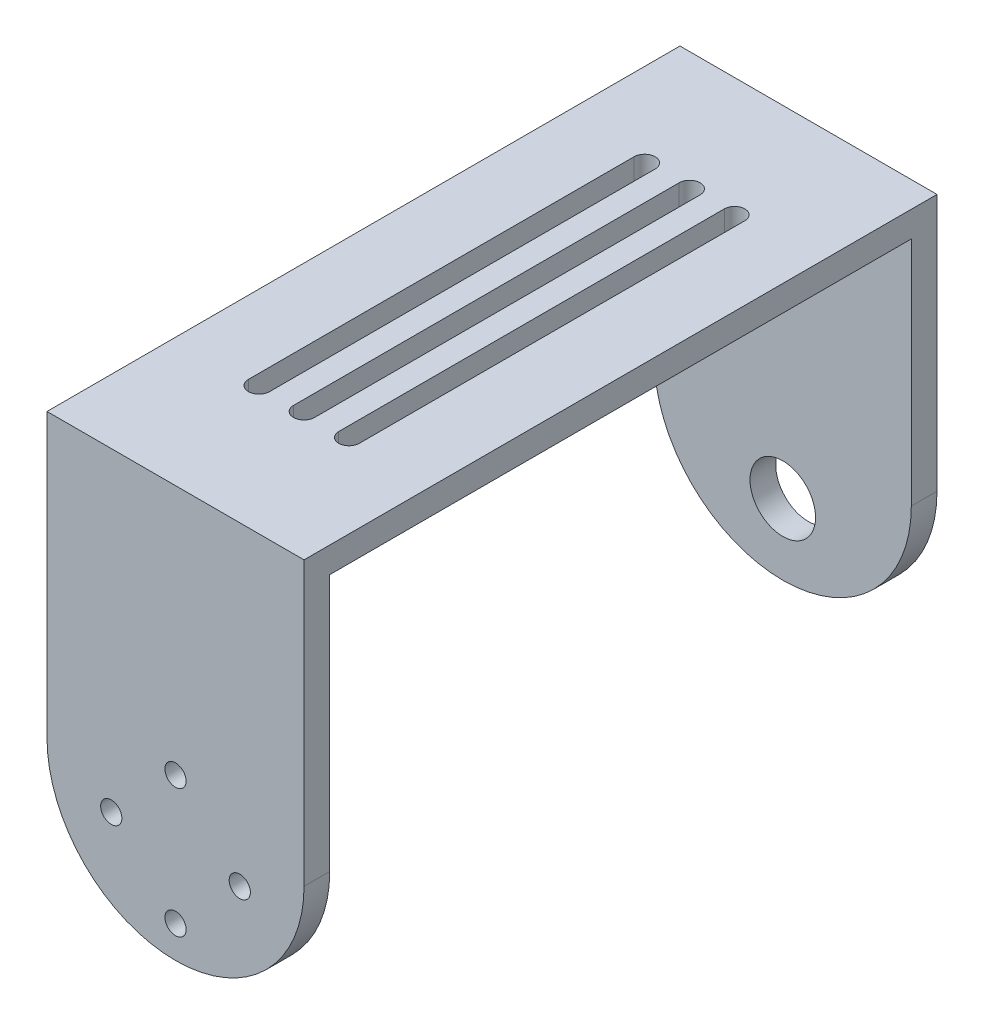
ISO-10303-21;
HEADER;
FILE_DESCRIPTION(('STEP AP214'),'2;1');
FILE_NAME('part.step','',(''),(''),'','','');
FILE_SCHEMA(('AUTOMOTIVE_DESIGN { 1 0 10303 214 1 1 1 1 }'));
ENDSEC;
DATA;
#1=APPLICATION_CONTEXT('core data for automotive mechanical design processes');
#2=APPLICATION_PROTOCOL_DEFINITION('international standard','automotive_design',2000,#1);
#3=PRODUCT_CONTEXT('',#1,'mechanical');
#4=PRODUCT('Part','Part','',(#3));
#5=PRODUCT_RELATED_PRODUCT_CATEGORY('part','',(#4));
#6=PRODUCT_DEFINITION_FORMATION('','',#4);
#7=PRODUCT_DEFINITION_CONTEXT('part definition',#1,'design');
#8=PRODUCT_DEFINITION('design','',#6,#7);
#9=PRODUCT_DEFINITION_SHAPE('','',#8);
#10=(LENGTH_UNIT() NAMED_UNIT(*) SI_UNIT(.MILLI.,.METRE.));
#11=(NAMED_UNIT(*) PLANE_ANGLE_UNIT() SI_UNIT($,.RADIAN.));
#12=(NAMED_UNIT(*) SI_UNIT($,.STERADIAN.) SOLID_ANGLE_UNIT());
#13=UNCERTAINTY_MEASURE_WITH_UNIT(LENGTH_MEASURE(1.E-05),#10,'distance_accuracy_value','');
#14=(GEOMETRIC_REPRESENTATION_CONTEXT(3) GLOBAL_UNCERTAINTY_ASSIGNED_CONTEXT((#13)) GLOBAL_UNIT_ASSIGNED_CONTEXT((#10,
#11,#12)) REPRESENTATION_CONTEXT('',''));
#15=CARTESIAN_POINT('',(0.,0.,0.));
#16=DIRECTION('',(0.,0.,1.));
#17=DIRECTION('',(1.,0.,0.));
#18=AXIS2_PLACEMENT_3D('',#15,#16,#17);
#19=CARTESIAN_POINT('',(0.,45.,-94.5));
#20=DIRECTION('',(0.,-1.,0.));
#21=DIRECTION('',(0.,0.,-1.));
#22=AXIS2_PLACEMENT_3D('',#19,#20,#21);
#23=PLANE('',#22);
#24=DIRECTION('',(0.,0.,1.));
#25=VECTOR('',#24,1.);
#26=CARTESIAN_POINT('',(-20.,45.,-94.5));
#27=LINE('',#26,#25);
#28=CARTESIAN_POINT('',(-20.,45.,-90.5));
#29=VERTEX_POINT('',#28);
#30=CARTESIAN_POINT('',(-20.,45.,0.));
#31=VERTEX_POINT('',#30);
#32=EDGE_CURVE('E320',#29,#31,#27,.T.);
#33=ORIENTED_EDGE('',*,*,#32,.F.);
#34=DIRECTION('',(1.,0.,0.));
#35=VECTOR('',#34,1.);
#36=CARTESIAN_POINT('',(0.,45.,-90.5));
#37=LINE('',#36,#35);
#38=CARTESIAN_POINT('',(20.,45.,-90.5));
#39=VERTEX_POINT('',#38);
#40=EDGE_CURVE('E353',#29,#39,#37,.T.);
#41=ORIENTED_EDGE('',*,*,#40,.T.);
#42=DIRECTION('',(0.,0.,1.));
#43=VECTOR('',#42,1.);
#44=CARTESIAN_POINT('',(20.,45.,-94.5));
#45=LINE('',#44,#43);
#46=CARTESIAN_POINT('',(20.,45.,0.));
#47=VERTEX_POINT('',#46);
#48=EDGE_CURVE('E317',#39,#47,#45,.T.);
#49=ORIENTED_EDGE('',*,*,#48,.T.);
#50=DIRECTION('',(-1.,0.,0.));
#51=VECTOR('',#50,1.);
#52=CARTESIAN_POINT('',(-20.,45.,0.));
#53=LINE('',#52,#51);
#54=EDGE_CURVE('E351',#47,#31,#53,.T.);
#55=ORIENTED_EDGE('',*,*,#54,.T.);
#56=EDGE_LOOP('',(#33,#41,#49,#55));
#57=FACE_BOUND('',#56,.T.);
#58=DIRECTION('',(0.,0.,-1.));
#59=VECTOR('',#58,1.);
#60=CARTESIAN_POINT('',(8.59818767924761,45.,-94.5));
#61=LINE('',#60,#59);
#62=CARTESIAN_POINT('',(8.59818767924761,45.,-16.0000000000001));
#63=VERTEX_POINT('',#62);
#64=CARTESIAN_POINT('',(8.59818767924761,45.,-76.0000000000001));
#65=VERTEX_POINT('',#64);
#66=EDGE_CURVE('E207',#63,#65,#61,.T.);
#67=ORIENTED_EDGE('',*,*,#66,.T.);
#68=CARTESIAN_POINT('',(7.00000000000009,45.,-76.0000000000001));
#69=DIRECTION('',(0.,-1.,0.));
#70=DIRECTION('',(0.,0.,-1.));
#71=AXIS2_PLACEMENT_3D('',#68,#69,#70);
#72=CIRCLE('',#71,1.59818767924752);
#73=CARTESIAN_POINT('',(5.40181232075257,45.,-76.0000000000001));
#74=VERTEX_POINT('',#73);
#75=EDGE_CURVE('E272',#65,#74,#72,.F.);
#76=ORIENTED_EDGE('',*,*,#75,.T.);
#77=DIRECTION('',(0.,0.,1.));
#78=VECTOR('',#77,1.);
#79=CARTESIAN_POINT('',(5.40181232075257,45.,-94.5));
#80=LINE('',#79,#78);
#81=CARTESIAN_POINT('',(5.40181232075257,45.,-16.0000000000001));
#82=VERTEX_POINT('',#81);
#83=EDGE_CURVE('E269',#74,#82,#80,.T.);
#84=ORIENTED_EDGE('',*,*,#83,.T.);
#85=CARTESIAN_POINT('',(7.00000000000009,45.,-16.0000000000001));
#86=DIRECTION('',(0.,-1.,0.));
#87=DIRECTION('',(0.,0.,-1.));
#88=AXIS2_PLACEMENT_3D('',#85,#86,#87);
#89=CIRCLE('',#88,1.59818767924752);
#90=EDGE_CURVE('E266',#82,#63,#89,.F.);
#91=ORIENTED_EDGE('',*,*,#90,.T.);
#92=EDGE_LOOP('',(#67,#76,#84,#91));
#93=FACE_BOUND('',#92,.T.);
#94=DIRECTION('',(0.,0.,-1.));
#95=VECTOR('',#94,1.);
#96=CARTESIAN_POINT('',(1.63452681944234,45.,-94.5));
#97=LINE('',#96,#95);
#98=CARTESIAN_POINT('',(1.63452681944234,45.,-16.0000000000001));
#99=VERTEX_POINT('',#98);
#100=CARTESIAN_POINT('',(1.63452681944234,45.,-76.0000000000001));
#101=VERTEX_POINT('',#100);
#102=EDGE_CURVE('E275',#99,#101,#97,.T.);
#103=ORIENTED_EDGE('',*,*,#102,.T.);
#104=CARTESIAN_POINT('',(0.,45.,-76.0000000000001));
#105=DIRECTION('',(0.,-1.,0.));
#106=DIRECTION('',(0.,0.,-1.));
#107=AXIS2_PLACEMENT_3D('',#104,#105,#106);
#108=CIRCLE('',#107,1.63452681944234);
#109=CARTESIAN_POINT('',(-1.63452681944234,45.,-76.0000000000001));
#110=VERTEX_POINT('',#109);
#111=EDGE_CURVE('E284',#101,#110,#108,.F.);
#112=ORIENTED_EDGE('',*,*,#111,.T.);
#113=DIRECTION('',(0.,0.,1.));
#114=VECTOR('',#113,1.);
#115=CARTESIAN_POINT('',(-1.63452681944234,45.,-94.5));
#116=LINE('',#115,#114);
#117=CARTESIAN_POINT('',(-1.63452681944234,45.,-16.0000000000001));
#118=VERTEX_POINT('',#117);
#119=EDGE_CURVE('E281',#110,#118,#116,.T.);
#120=ORIENTED_EDGE('',*,*,#119,.T.);
#121=CARTESIAN_POINT('',(0.,45.,-16.0000000000001));
#122=DIRECTION('',(0.,-1.,0.));
#123=DIRECTION('',(0.,0.,-1.));
#124=AXIS2_PLACEMENT_3D('',#121,#122,#123);
#125=CIRCLE('',#124,1.63452681944234);
#126=EDGE_CURVE('E278',#118,#99,#125,.F.);
#127=ORIENTED_EDGE('',*,*,#126,.T.);
#128=EDGE_LOOP('',(#103,#112,#120,#127));
#129=FACE_BOUND('',#128,.T.);
#130=DIRECTION('',(0.,0.,1.));
#131=VECTOR('',#130,1.);
#132=CARTESIAN_POINT('',(-8.6499999999999,45.,-94.5));
#133=LINE('',#132,#131);
#134=CARTESIAN_POINT('',(-8.6499999999999,45.,-76.0000000000001));
#135=VERTEX_POINT('',#134);
#136=CARTESIAN_POINT('',(-8.6499999999999,45.,-16.0000000000001));
#137=VERTEX_POINT('',#136);
#138=EDGE_CURVE('E287',#135,#137,#133,.T.);
#139=ORIENTED_EDGE('',*,*,#138,.T.);
#140=CARTESIAN_POINT('',(-6.9999999999999,45.,-16.0000000000001));
#141=DIRECTION('',(0.,-1.,0.));
#142=DIRECTION('',(0.,0.,-1.));
#143=AXIS2_PLACEMENT_3D('',#140,#141,#142);
#144=CIRCLE('',#143,1.65);
#145=CARTESIAN_POINT('',(-5.3499999999999,45.,-16.0000000000001));
#146=VERTEX_POINT('',#145);
#147=EDGE_CURVE('E294',#137,#146,#144,.F.);
#148=ORIENTED_EDGE('',*,*,#147,.T.);
#149=DIRECTION('',(0.,0.,-1.));
#150=VECTOR('',#149,1.);
#151=CARTESIAN_POINT('',(-5.3499999999999,45.,-94.5));
#152=LINE('',#151,#150);
#153=CARTESIAN_POINT('',(-5.3499999999999,45.,-76.0000000000001));
#154=VERTEX_POINT('',#153);
#155=EDGE_CURVE('E206',#146,#154,#152,.T.);
#156=ORIENTED_EDGE('',*,*,#155,.T.);
#157=CARTESIAN_POINT('',(-6.9999999999999,45.,-76.0000000000001));
#158=DIRECTION('',(0.,-1.,0.));
#159=DIRECTION('',(0.,0.,-1.));
#160=AXIS2_PLACEMENT_3D('',#157,#158,#159);
#161=CIRCLE('',#160,1.65);
#162=EDGE_CURVE('E290',#154,#135,#161,.F.);
#163=ORIENTED_EDGE('',*,*,#162,.T.);
#164=EDGE_LOOP('',(#139,#148,#156,#163));
#165=FACE_BOUND('',#164,.T.);
#166=ADVANCED_FACE('F40',(#57,#93,#129,#165),#23,.T.);
#167=CARTESIAN_POINT('',(0.,49.,-94.5));
#168=DIRECTION('',(0.,1.,0.));
#169=DIRECTION('',(0.,0.,1.));
#170=AXIS2_PLACEMENT_3D('',#167,#168,#169);
#171=PLANE('',#170);
#172=DIRECTION('',(0.,0.,1.));
#173=VECTOR('',#172,1.);
#174=CARTESIAN_POINT('',(-20.,49.,-94.5));
#175=LINE('',#174,#173);
#176=CARTESIAN_POINT('',(-20.,49.,-94.5));
#177=VERTEX_POINT('',#176);
#178=CARTESIAN_POINT('',(-20.,49.,4.));
#179=VERTEX_POINT('',#178);
#180=EDGE_CURVE('E310',#177,#179,#175,.T.);
#181=ORIENTED_EDGE('',*,*,#180,.T.);
#182=DIRECTION('',(-1.,0.,0.));
#183=VECTOR('',#182,1.);
#184=CARTESIAN_POINT('',(0.,49.,4.));
#185=LINE('',#184,#183);
#186=CARTESIAN_POINT('',(20.,49.,4.));
#187=VERTEX_POINT('',#186);
#188=EDGE_CURVE('E301',#187,#179,#185,.T.);
#189=ORIENTED_EDGE('',*,*,#188,.F.);
#190=DIRECTION('',(0.,0.,1.));
#191=VECTOR('',#190,1.);
#192=CARTESIAN_POINT('',(20.,49.,-94.5));
#193=LINE('',#192,#191);
#194=CARTESIAN_POINT('',(20.,49.,-94.5));
#195=VERTEX_POINT('',#194);
#196=EDGE_CURVE('E313',#195,#187,#193,.T.);
#197=ORIENTED_EDGE('',*,*,#196,.F.);
#198=DIRECTION('',(-1.,0.,0.));
#199=VECTOR('',#198,1.);
#200=CARTESIAN_POINT('',(0.,49.,-94.5));
#201=LINE('',#200,#199);
#202=EDGE_CURVE('E302',#195,#177,#201,.T.);
#203=ORIENTED_EDGE('',*,*,#202,.T.);
#204=EDGE_LOOP('',(#181,#189,#197,#203));
#205=FACE_BOUND('',#204,.T.);
#206=DIRECTION('',(0.,0.,1.));
#207=VECTOR('',#206,1.);
#208=CARTESIAN_POINT('',(5.40181232075257,49.,-76.0000000000001));
#209=LINE('',#208,#207);
#210=CARTESIAN_POINT('',(5.40181232075257,49.,-76.0000000000001));
#211=VERTEX_POINT('',#210);
#212=CARTESIAN_POINT('',(5.40181232075257,49.,-16.0000000000001));
#213=VERTEX_POINT('',#212);
#214=EDGE_CURVE('E261',#211,#213,#209,.T.);
#215=ORIENTED_EDGE('',*,*,#214,.F.);
#216=CARTESIAN_POINT('',(7.00000000000009,49.,-76.0000000000001));
#217=DIRECTION('',(0.,1.,0.));
#218=DIRECTION('',(0.,0.,1.));
#219=AXIS2_PLACEMENT_3D('',#216,#217,#218);
#220=CIRCLE('',#219,1.59818767924752);
#221=CARTESIAN_POINT('',(8.59818767924761,49.,-76.0000000000001));
#222=VERTEX_POINT('',#221);
#223=EDGE_CURVE('E229',#222,#211,#220,.T.);
#224=ORIENTED_EDGE('',*,*,#223,.F.);
#225=DIRECTION('',(0.,0.,-1.));
#226=VECTOR('',#225,1.);
#227=CARTESIAN_POINT('',(8.59818767924761,49.,-76.0000000000001));
#228=LINE('',#227,#226);
#229=CARTESIAN_POINT('',(8.59818767924761,49.,-16.0000000000001));
#230=VERTEX_POINT('',#229);
#231=EDGE_CURVE('E256',#230,#222,#228,.T.);
#232=ORIENTED_EDGE('',*,*,#231,.F.);
#233=CARTESIAN_POINT('',(7.00000000000009,49.,-16.0000000000001));
#234=DIRECTION('',(0.,1.,0.));
#235=DIRECTION('',(0.,0.,1.));
#236=AXIS2_PLACEMENT_3D('',#233,#234,#235);
#237=CIRCLE('',#236,1.59818767924752);
#238=EDGE_CURVE('E258',#213,#230,#237,.T.);
#239=ORIENTED_EDGE('',*,*,#238,.F.);
#240=EDGE_LOOP('',(#215,#224,#232,#239));
#241=FACE_BOUND('',#240,.T.);
#242=DIRECTION('',(0.,0.,1.));
#243=VECTOR('',#242,1.);
#244=CARTESIAN_POINT('',(-1.63452681944234,49.,-76.0000000000001));
#245=LINE('',#244,#243);
#246=CARTESIAN_POINT('',(-1.63452681944234,49.,-76.0000000000001));
#247=VERTEX_POINT('',#246);
#248=CARTESIAN_POINT('',(-1.63452681944234,49.,-16.0000000000001));
#249=VERTEX_POINT('',#248);
#250=EDGE_CURVE('E241',#247,#249,#245,.T.);
#251=ORIENTED_EDGE('',*,*,#250,.F.);
#252=CARTESIAN_POINT('',(0.,49.,-76.0000000000001));
#253=DIRECTION('',(0.,1.,0.));
#254=DIRECTION('',(0.,0.,1.));
#255=AXIS2_PLACEMENT_3D('',#252,#253,#254);
#256=CIRCLE('',#255,1.63452681944234);
#257=CARTESIAN_POINT('',(1.63452681944234,49.,-76.0000000000001));
#258=VERTEX_POINT('',#257);
#259=EDGE_CURVE('E199',#258,#247,#256,.T.);
#260=ORIENTED_EDGE('',*,*,#259,.F.);
#261=DIRECTION('',(0.,0.,-1.));
#262=VECTOR('',#261,1.);
#263=CARTESIAN_POINT('',(1.63452681944234,49.,-76.0000000000001));
#264=LINE('',#263,#262);
#265=CARTESIAN_POINT('',(1.63452681944234,49.,-16.0000000000001));
#266=VERTEX_POINT('',#265);
#267=EDGE_CURVE('E236',#266,#258,#264,.T.);
#268=ORIENTED_EDGE('',*,*,#267,.F.);
#269=CARTESIAN_POINT('',(0.,49.,-16.0000000000001));
#270=DIRECTION('',(0.,1.,0.));
#271=DIRECTION('',(0.,0.,1.));
#272=AXIS2_PLACEMENT_3D('',#269,#270,#271);
#273=CIRCLE('',#272,1.63452681944234);
#274=EDGE_CURVE('E238',#249,#266,#273,.T.);
#275=ORIENTED_EDGE('',*,*,#274,.F.);
#276=EDGE_LOOP('',(#251,#260,#268,#275));
#277=FACE_BOUND('',#276,.T.);
#278=DIRECTION('',(0.,0.,-1.));
#279=VECTOR('',#278,1.);
#280=CARTESIAN_POINT('',(-5.3499999999999,49.,-16.0000000000001));
#281=LINE('',#280,#279);
#282=CARTESIAN_POINT('',(-5.3499999999999,49.,-16.0000000000001));
#283=VERTEX_POINT('',#282);
#284=CARTESIAN_POINT('',(-5.3499999999999,49.,-76.0000000000001));
#285=VERTEX_POINT('',#284);
#286=EDGE_CURVE('E198',#283,#285,#281,.T.);
#287=ORIENTED_EDGE('',*,*,#286,.F.);
#288=CARTESIAN_POINT('',(-6.9999999999999,49.,-16.0000000000001));
#289=DIRECTION('',(0.,1.,0.));
#290=DIRECTION('',(0.,0.,1.));
#291=AXIS2_PLACEMENT_3D('',#288,#289,#290);
#292=CIRCLE('',#291,1.65);
#293=CARTESIAN_POINT('',(-8.6499999999999,49.,-16.0000000000001));
#294=VERTEX_POINT('',#293);
#295=EDGE_CURVE('E190',#294,#283,#292,.T.);
#296=ORIENTED_EDGE('',*,*,#295,.F.);
#297=DIRECTION('',(0.,0.,1.));
#298=VECTOR('',#297,1.);
#299=CARTESIAN_POINT('',(-8.6499999999999,49.,-16.0000000000001));
#300=LINE('',#299,#298);
#301=CARTESIAN_POINT('',(-8.6499999999999,49.,-76.0000000000001));
#302=VERTEX_POINT('',#301);
#303=EDGE_CURVE('E215',#302,#294,#300,.T.);
#304=ORIENTED_EDGE('',*,*,#303,.F.);
#305=CARTESIAN_POINT('',(-6.9999999999999,49.,-76.0000000000001));
#306=DIRECTION('',(0.,1.,0.));
#307=DIRECTION('',(0.,0.,1.));
#308=AXIS2_PLACEMENT_3D('',#305,#306,#307);
#309=CIRCLE('',#308,1.65);
#310=EDGE_CURVE('E213',#285,#302,#309,.T.);
#311=ORIENTED_EDGE('',*,*,#310,.F.);
#312=EDGE_LOOP('',(#287,#296,#304,#311));
#313=FACE_BOUND('',#312,.T.);
#314=ADVANCED_FACE('F211',(#205,#241,#277,#313),#171,.T.);
#315=CARTESIAN_POINT('',(0.,0.,4.));
#316=DIRECTION('',(0.,0.,-1.));
#317=DIRECTION('',(-1.,0.,0.));
#318=AXIS2_PLACEMENT_3D('',#315,#316,#317);
#319=PLANE('',#318);
#320=CARTESIAN_POINT('',(0.,5.,4.));
#321=DIRECTION('',(0.,0.,-1.));
#322=DIRECTION('',(-1.,0.,0.));
#323=AXIS2_PLACEMENT_3D('',#320,#321,#322);
#324=CIRCLE('',#323,20.);
#325=CARTESIAN_POINT('',(-20.,4.99999999999999,4.));
#326=VERTEX_POINT('',#325);
#327=CARTESIAN_POINT('',(0.,-15.,4.));
#328=VERTEX_POINT('',#327);
#329=EDGE_CURVE('E49',#326,#328,#324,.F.);
#330=ORIENTED_EDGE('',*,*,#329,.T.);
#331=CARTESIAN_POINT('',(0.,5.,4.));
#332=DIRECTION('',(0.,0.,-1.));
#333=DIRECTION('',(-1.,0.,0.));
#334=AXIS2_PLACEMENT_3D('',#331,#332,#333);
#335=CIRCLE('',#334,20.);
#336=CARTESIAN_POINT('',(20.,5.,4.));
#337=VERTEX_POINT('',#336);
#338=EDGE_CURVE('E11',#328,#337,#335,.F.);
#339=ORIENTED_EDGE('',*,*,#338,.T.);
#340=DIRECTION('',(0.,1.,0.));
#341=VECTOR('',#340,1.);
#342=CARTESIAN_POINT('',(20.,-15.,4.));
#343=LINE('',#342,#341);
#344=EDGE_CURVE('E350',#337,#187,#343,.T.);
#345=ORIENTED_EDGE('',*,*,#344,.T.);
#346=ORIENTED_EDGE('',*,*,#188,.T.);
#347=DIRECTION('',(0.,-1.,0.));
#348=VECTOR('',#347,1.);
#349=CARTESIAN_POINT('',(-20.,0.,4.));
#350=LINE('',#349,#348);
#351=EDGE_CURVE('E347',#179,#326,#350,.T.);
#352=ORIENTED_EDGE('',*,*,#351,.T.);
#353=EDGE_LOOP('',(#330,#339,#345,#346,#352));
#354=FACE_BOUND('',#353,.T.);
#355=CARTESIAN_POINT('',(-10.,0.,4.));
#356=DIRECTION('',(0.,0.,1.));
#357=DIRECTION('',(1.,0.,0.));
#358=AXIS2_PLACEMENT_3D('',#355,#356,#357);
#359=CIRCLE('',#358,1.64999999999998);
#360=CARTESIAN_POINT('',(-8.35000000000002,0.,4.));
#361=VERTEX_POINT('',#360);
#362=EDGE_CURVE('E341',#361,#361,#359,.T.);
#363=ORIENTED_EDGE('',*,*,#362,.F.);
#364=EDGE_LOOP('',(#363));
#365=FACE_BOUND('',#364,.T.);
#366=CARTESIAN_POINT('',(0.,10.,4.));
#367=DIRECTION('',(0.,0.,1.));
#368=DIRECTION('',(1.,0.,0.));
#369=AXIS2_PLACEMENT_3D('',#366,#367,#368);
#370=CIRCLE('',#369,1.64999999999999);
#371=CARTESIAN_POINT('',(1.64999999999999,10.,4.));
#372=VERTEX_POINT('',#371);
#373=EDGE_CURVE('E335',#372,#372,#370,.T.);
#374=ORIENTED_EDGE('',*,*,#373,.F.);
#375=EDGE_LOOP('',(#374));
#376=FACE_BOUND('',#375,.T.);
#377=CARTESIAN_POINT('',(0.,-10.,4.));
#378=DIRECTION('',(0.,0.,1.));
#379=DIRECTION('',(1.,0.,0.));
#380=AXIS2_PLACEMENT_3D('',#377,#378,#379);
#381=CIRCLE('',#380,1.64999999999998);
#382=CARTESIAN_POINT('',(1.65000000000002,-10.,4.));
#383=VERTEX_POINT('',#382);
#384=EDGE_CURVE('E329',#383,#383,#381,.T.);
#385=ORIENTED_EDGE('',*,*,#384,.F.);
#386=EDGE_LOOP('',(#385));
#387=FACE_BOUND('',#386,.T.);
#388=CARTESIAN_POINT('',(10.,0.,4.));
#389=DIRECTION('',(0.,0.,1.));
#390=DIRECTION('',(1.,0.,0.));
#391=AXIS2_PLACEMENT_3D('',#388,#389,#390);
#392=CIRCLE('',#391,1.64999999999999);
#393=CARTESIAN_POINT('',(11.65,0.,4.));
#394=VERTEX_POINT('',#393);
#395=EDGE_CURVE('E323',#394,#394,#392,.T.);
#396=ORIENTED_EDGE('',*,*,#395,.F.);
#397=EDGE_LOOP('',(#396));
#398=FACE_BOUND('',#397,.T.);
#399=ADVANCED_FACE('F424',(#354,#365,#376,#387,#398),#319,.F.);
#400=CARTESIAN_POINT('',(0.,0.,0.));
#401=DIRECTION('',(0.,0.,-1.));
#402=DIRECTION('',(-1.,0.,0.));
#403=AXIS2_PLACEMENT_3D('',#400,#401,#402);
#404=PLANE('',#403);
#405=CARTESIAN_POINT('',(0.,-10.,0.));
#406=DIRECTION('',(0.,0.,1.));
#407=DIRECTION('',(1.,0.,0.));
#408=AXIS2_PLACEMENT_3D('',#405,#406,#407);
#409=CIRCLE('',#408,1.64999999999998);
#410=CARTESIAN_POINT('',(1.65000000000002,-10.,0.));
#411=VERTEX_POINT('',#410);
#412=EDGE_CURVE('E326',#411,#411,#409,.T.);
#413=ORIENTED_EDGE('',*,*,#412,.T.);
#414=EDGE_LOOP('',(#413));
#415=FACE_BOUND('',#414,.T.);
#416=CARTESIAN_POINT('',(-10.,0.,0.));
#417=DIRECTION('',(0.,0.,1.));
#418=DIRECTION('',(1.,0.,0.));
#419=AXIS2_PLACEMENT_3D('',#416,#417,#418);
#420=CIRCLE('',#419,1.64999999999998);
#421=CARTESIAN_POINT('',(-8.35000000000002,0.,0.));
#422=VERTEX_POINT('',#421);
#423=EDGE_CURVE('E338',#422,#422,#420,.T.);
#424=ORIENTED_EDGE('',*,*,#423,.T.);
#425=EDGE_LOOP('',(#424));
#426=FACE_BOUND('',#425,.T.);
#427=DIRECTION('',(0.,1.,0.));
#428=VECTOR('',#427,1.);
#429=CARTESIAN_POINT('',(20.,3.14779270824593,0.));
#430=LINE('',#429,#428);
#431=CARTESIAN_POINT('',(20.,5.,0.));
#432=VERTEX_POINT('',#431);
#433=EDGE_CURVE('E356',#432,#47,#430,.T.);
#434=ORIENTED_EDGE('',*,*,#433,.F.);
#435=CARTESIAN_POINT('',(0.,5.,0.));
#436=DIRECTION('',(0.,0.,-1.));
#437=DIRECTION('',(-1.,0.,0.));
#438=AXIS2_PLACEMENT_3D('',#435,#436,#437);
#439=CIRCLE('',#438,20.);
#440=CARTESIAN_POINT('',(0.,-15.,0.));
#441=VERTEX_POINT('',#440);
#442=EDGE_CURVE('E382',#432,#441,#439,.T.);
#443=ORIENTED_EDGE('',*,*,#442,.T.);
#444=CARTESIAN_POINT('',(0.,5.,0.));
#445=DIRECTION('',(0.,0.,-1.));
#446=DIRECTION('',(-1.,0.,0.));
#447=AXIS2_PLACEMENT_3D('',#444,#445,#446);
#448=CIRCLE('',#447,20.);
#449=CARTESIAN_POINT('',(-20.,5.,0.));
#450=VERTEX_POINT('',#449);
#451=EDGE_CURVE('E380',#441,#450,#448,.T.);
#452=ORIENTED_EDGE('',*,*,#451,.T.);
#453=DIRECTION('',(0.,-1.,0.));
#454=VECTOR('',#453,1.);
#455=CARTESIAN_POINT('',(-20.,0.,0.));
#456=LINE('',#455,#454);
#457=EDGE_CURVE('E344',#31,#450,#456,.T.);
#458=ORIENTED_EDGE('',*,*,#457,.F.);
#459=ORIENTED_EDGE('',*,*,#54,.F.);
#460=EDGE_LOOP('',(#434,#443,#452,#458,#459));
#461=FACE_BOUND('',#460,.T.);
#462=CARTESIAN_POINT('',(0.,10.,0.));
#463=DIRECTION('',(0.,0.,1.));
#464=DIRECTION('',(1.,0.,0.));
#465=AXIS2_PLACEMENT_3D('',#462,#463,#464);
#466=CIRCLE('',#465,1.64999999999999);
#467=CARTESIAN_POINT('',(1.64999999999999,10.,0.));
#468=VERTEX_POINT('',#467);
#469=EDGE_CURVE('E332',#468,#468,#466,.T.);
#470=ORIENTED_EDGE('',*,*,#469,.T.);
#471=EDGE_LOOP('',(#470));
#472=FACE_BOUND('',#471,.T.);
#473=CARTESIAN_POINT('',(10.,0.,0.));
#474=DIRECTION('',(0.,0.,1.));
#475=DIRECTION('',(1.,0.,0.));
#476=AXIS2_PLACEMENT_3D('',#473,#474,#475);
#477=CIRCLE('',#476,1.64999999999999);
#478=CARTESIAN_POINT('',(11.65,0.,0.));
#479=VERTEX_POINT('',#478);
#480=EDGE_CURVE('E316',#479,#479,#477,.T.);
#481=ORIENTED_EDGE('',*,*,#480,.T.);
#482=EDGE_LOOP('',(#481));
#483=FACE_BOUND('',#482,.T.);
#484=ADVANCED_FACE('F401',(#415,#426,#461,#472,#483),#404,.T.);
#485=CARTESIAN_POINT('',(-20.,0.,4.));
#486=DIRECTION('',(1.,0.,0.));
#487=DIRECTION('',(0.,1.,0.));
#488=AXIS2_PLACEMENT_3D('',#485,#486,#487);
#489=PLANE('',#488);
#490=DIRECTION('',(0.,-1.,0.));
#491=VECTOR('',#490,1.);
#492=CARTESIAN_POINT('',(-20.,0.,-94.5));
#493=LINE('',#492,#491);
#494=CARTESIAN_POINT('',(-20.,9.,-94.5));
#495=VERTEX_POINT('',#494);
#496=EDGE_CURVE('E305',#177,#495,#493,.T.);
#497=ORIENTED_EDGE('',*,*,#496,.T.);
#498=DIRECTION('',(0.,0.,-1.));
#499=VECTOR('',#498,1.);
#500=CARTESIAN_POINT('',(-20.,9.,-90.5));
#501=LINE('',#500,#499);
#502=CARTESIAN_POINT('',(-20.,9.,-90.5));
#503=VERTEX_POINT('',#502);
#504=EDGE_CURVE('E368',#495,#503,#501,.F.);
#505=ORIENTED_EDGE('',*,*,#504,.T.);
#506=DIRECTION('',(0.,1.,0.));
#507=VECTOR('',#506,1.);
#508=CARTESIAN_POINT('',(-20.,-11.,-90.5));
#509=LINE('',#508,#507);
#510=EDGE_CURVE('E298',#503,#29,#509,.T.);
#511=ORIENTED_EDGE('',*,*,#510,.T.);
#512=ORIENTED_EDGE('',*,*,#32,.T.);
#513=ORIENTED_EDGE('',*,*,#457,.T.);
#514=DIRECTION('',(0.,0.,-1.));
#515=VECTOR('',#514,1.);
#516=CARTESIAN_POINT('',(-20.,5.,4.));
#517=LINE('',#516,#515);
#518=EDGE_CURVE('E366',#450,#326,#517,.F.);
#519=ORIENTED_EDGE('',*,*,#518,.T.);
#520=ORIENTED_EDGE('',*,*,#351,.F.);
#521=ORIENTED_EDGE('',*,*,#180,.F.);
#522=EDGE_LOOP('',(#497,#505,#511,#512,#513,#519,#520,#521));
#523=FACE_BOUND('',#522,.T.);
#524=ADVANCED_FACE('F405',(#523),#489,.F.);
#525=CARTESIAN_POINT('',(20.,3.14779270824593,4.));
#526=DIRECTION('',(-1.,0.,0.));
#527=DIRECTION('',(0.,0.,1.));
#528=AXIS2_PLACEMENT_3D('',#525,#526,#527);
#529=PLANE('',#528);
#530=DIRECTION('',(0.,1.,0.));
#531=VECTOR('',#530,1.);
#532=CARTESIAN_POINT('',(20.,-11.,-90.5));
#533=LINE('',#532,#531);
#534=CARTESIAN_POINT('',(20.,9.00000000000001,-90.5));
#535=VERTEX_POINT('',#534);
#536=EDGE_CURVE('E296',#535,#39,#533,.T.);
#537=ORIENTED_EDGE('',*,*,#536,.F.);
#538=DIRECTION('',(0.,0.,1.));
#539=VECTOR('',#538,1.);
#540=CARTESIAN_POINT('',(20.,9.00000000000001,-94.5));
#541=LINE('',#540,#539);
#542=CARTESIAN_POINT('',(20.,9.00000000000001,-94.5));
#543=VERTEX_POINT('',#542);
#544=EDGE_CURVE('E378',#535,#543,#541,.F.);
#545=ORIENTED_EDGE('',*,*,#544,.T.);
#546=DIRECTION('',(0.,1.,0.));
#547=VECTOR('',#546,1.);
#548=CARTESIAN_POINT('',(20.,0.,-94.5));
#549=LINE('',#548,#547);
#550=EDGE_CURVE('E308',#543,#195,#549,.T.);
#551=ORIENTED_EDGE('',*,*,#550,.T.);
#552=ORIENTED_EDGE('',*,*,#196,.T.);
#553=ORIENTED_EDGE('',*,*,#344,.F.);
#554=DIRECTION('',(0.,0.,-1.));
#555=VECTOR('',#554,1.);
#556=CARTESIAN_POINT('',(20.,5.,4.));
#557=LINE('',#556,#555);
#558=EDGE_CURVE('E375',#337,#432,#557,.T.);
#559=ORIENTED_EDGE('',*,*,#558,.T.);
#560=ORIENTED_EDGE('',*,*,#433,.T.);
#561=ORIENTED_EDGE('',*,*,#48,.F.);
#562=EDGE_LOOP('',(#537,#545,#551,#552,#553,#559,#560,#561));
#563=FACE_BOUND('',#562,.T.);
#564=ADVANCED_FACE('F419',(#563),#529,.F.);
#565=CARTESIAN_POINT('',(-10.,0.,4.));
#566=DIRECTION('',(0.,0.,-1.));
#567=DIRECTION('',(-1.,0.,0.));
#568=AXIS2_PLACEMENT_3D('',#565,#566,#567);
#569=CYLINDRICAL_SURFACE('',#568,1.64999999999998);
#570=ORIENTED_EDGE('',*,*,#362,.T.);
#571=EDGE_LOOP('',(#570));
#572=FACE_BOUND('',#571,.T.);
#573=ORIENTED_EDGE('',*,*,#423,.F.);
#574=EDGE_LOOP('',(#573));
#575=FACE_BOUND('',#574,.T.);
#576=ADVANCED_FACE('F485',(#572,#575),#569,.F.);
#577=CARTESIAN_POINT('',(0.,10.,4.));
#578=DIRECTION('',(0.,0.,-1.));
#579=DIRECTION('',(-1.,0.,0.));
#580=AXIS2_PLACEMENT_3D('',#577,#578,#579);
#581=CYLINDRICAL_SURFACE('',#580,1.64999999999999);
#582=ORIENTED_EDGE('',*,*,#373,.T.);
#583=EDGE_LOOP('',(#582));
#584=FACE_BOUND('',#583,.T.);
#585=ORIENTED_EDGE('',*,*,#469,.F.);
#586=EDGE_LOOP('',(#585));
#587=FACE_BOUND('',#586,.T.);
#588=ADVANCED_FACE('F481',(#584,#587),#581,.F.);
#589=CARTESIAN_POINT('',(0.,-10.,4.));
#590=DIRECTION('',(0.,0.,-1.));
#591=DIRECTION('',(-1.,0.,0.));
#592=AXIS2_PLACEMENT_3D('',#589,#590,#591);
#593=CYLINDRICAL_SURFACE('',#592,1.64999999999998);
#594=ORIENTED_EDGE('',*,*,#384,.T.);
#595=EDGE_LOOP('',(#594));
#596=FACE_BOUND('',#595,.T.);
#597=ORIENTED_EDGE('',*,*,#412,.F.);
#598=EDGE_LOOP('',(#597));
#599=FACE_BOUND('',#598,.T.);
#600=ADVANCED_FACE('F477',(#596,#599),#593,.F.);
#601=CARTESIAN_POINT('',(10.,0.,4.));
#602=DIRECTION('',(0.,0.,-1.));
#603=DIRECTION('',(-1.,0.,0.));
#604=AXIS2_PLACEMENT_3D('',#601,#602,#603);
#605=CYLINDRICAL_SURFACE('',#604,1.64999999999999);
#606=ORIENTED_EDGE('',*,*,#395,.T.);
#607=EDGE_LOOP('',(#606));
#608=FACE_BOUND('',#607,.T.);
#609=ORIENTED_EDGE('',*,*,#480,.F.);
#610=EDGE_LOOP('',(#609));
#611=FACE_BOUND('',#610,.T.);
#612=ADVANCED_FACE('F474',(#608,#611),#605,.F.);
#613=CARTESIAN_POINT('',(0.,0.,-94.5));
#614=DIRECTION('',(0.,0.,1.));
#615=DIRECTION('',(1.,0.,0.));
#616=AXIS2_PLACEMENT_3D('',#613,#614,#615);
#617=PLANE('',#616);
#618=CARTESIAN_POINT('',(0.,0.,-94.5));
#619=DIRECTION('',(0.,0.,1.));
#620=DIRECTION('',(1.,0.,0.));
#621=AXIS2_PLACEMENT_3D('',#618,#619,#620);
#622=CIRCLE('',#621,5.1);
#623=CARTESIAN_POINT('',(5.1,0.,-94.5));
#624=VERTEX_POINT('',#623);
#625=EDGE_CURVE('E248',#624,#624,#622,.F.);
#626=ORIENTED_EDGE('',*,*,#625,.F.);
#627=EDGE_LOOP('',(#626));
#628=FACE_BOUND('',#627,.T.);
#629=CARTESIAN_POINT('',(0.,9.00000000000001,-94.5));
#630=DIRECTION('',(0.,0.,1.));
#631=DIRECTION('',(1.,0.,0.));
#632=AXIS2_PLACEMENT_3D('',#629,#630,#631);
#633=CIRCLE('',#632,20.);
#634=CARTESIAN_POINT('',(0.,-11.,-94.5));
#635=VERTEX_POINT('',#634);
#636=EDGE_CURVE('E362',#543,#635,#633,.F.);
#637=ORIENTED_EDGE('',*,*,#636,.T.);
#638=CARTESIAN_POINT('',(0.,9.00000000000001,-94.5));
#639=DIRECTION('',(0.,0.,1.));
#640=DIRECTION('',(1.,0.,0.));
#641=AXIS2_PLACEMENT_3D('',#638,#639,#640);
#642=CIRCLE('',#641,20.);
#643=EDGE_CURVE('E364',#635,#495,#642,.F.);
#644=ORIENTED_EDGE('',*,*,#643,.T.);
#645=ORIENTED_EDGE('',*,*,#496,.F.);
#646=ORIENTED_EDGE('',*,*,#202,.F.);
#647=ORIENTED_EDGE('',*,*,#550,.F.);
#648=EDGE_LOOP('',(#637,#644,#645,#646,#647));
#649=FACE_BOUND('',#648,.T.);
#650=ADVANCED_FACE('F431',(#628,#649),#617,.F.);
#651=CARTESIAN_POINT('',(0.,-11.,-90.5));
#652=DIRECTION('',(0.,0.,-1.));
#653=DIRECTION('',(-1.,0.,0.));
#654=AXIS2_PLACEMENT_3D('',#651,#652,#653);
#655=PLANE('',#654);
#656=CARTESIAN_POINT('',(0.,0.,-90.5));
#657=DIRECTION('',(0.,0.,-1.));
#658=DIRECTION('',(-1.,0.,0.));
#659=AXIS2_PLACEMENT_3D('',#656,#657,#658);
#660=CIRCLE('',#659,5.1);
#661=CARTESIAN_POINT('',(-5.1,0.,-90.5));
#662=VERTEX_POINT('',#661);
#663=EDGE_CURVE('E727',#662,#662,#660,.T.);
#664=ORIENTED_EDGE('',*,*,#663,.T.);
#665=EDGE_LOOP('',(#664));
#666=FACE_BOUND('',#665,.T.);
#667=ORIENTED_EDGE('',*,*,#510,.F.);
#668=CARTESIAN_POINT('',(0.,9.00000000000001,-90.5));
#669=DIRECTION('',(0.,0.,-1.));
#670=DIRECTION('',(-1.,0.,0.));
#671=AXIS2_PLACEMENT_3D('',#668,#669,#670);
#672=CIRCLE('',#671,20.);
#673=CARTESIAN_POINT('',(0.,-11.,-90.5));
#674=VERTEX_POINT('',#673);
#675=EDGE_CURVE('E373',#503,#674,#672,.F.);
#676=ORIENTED_EDGE('',*,*,#675,.T.);
#677=CARTESIAN_POINT('',(0.,9.00000000000001,-90.5));
#678=DIRECTION('',(0.,0.,-1.));
#679=DIRECTION('',(-1.,0.,0.));
#680=AXIS2_PLACEMENT_3D('',#677,#678,#679);
#681=CIRCLE('',#680,20.);
#682=EDGE_CURVE('E371',#674,#535,#681,.F.);
#683=ORIENTED_EDGE('',*,*,#682,.T.);
#684=ORIENTED_EDGE('',*,*,#536,.T.);
#685=ORIENTED_EDGE('',*,*,#40,.F.);
#686=EDGE_LOOP('',(#667,#676,#683,#684,#685));
#687=FACE_BOUND('',#686,.T.);
#688=ADVANCED_FACE('F413',(#666,#687),#655,.F.);
#689=CARTESIAN_POINT('',(0.,9.00000000000001,0.));
#690=DIRECTION('',(0.,0.,-1.));
#691=DIRECTION('',(-1.,0.,0.));
#692=AXIS2_PLACEMENT_3D('',#689,#690,#691);
#693=CYLINDRICAL_SURFACE('',#692,20.);
#694=ORIENTED_EDGE('',*,*,#544,.F.);
#695=ORIENTED_EDGE('',*,*,#682,.F.);
#696=DIRECTION('',(0.,0.,1.));
#697=VECTOR('',#696,1.);
#698=CARTESIAN_POINT('',(0.,-11.,-90.5));
#699=LINE('',#698,#697);
#700=EDGE_CURVE('E299',#635,#674,#699,.T.);
#701=ORIENTED_EDGE('',*,*,#700,.F.);
#702=ORIENTED_EDGE('',*,*,#636,.F.);
#703=EDGE_LOOP('',(#694,#695,#701,#702));
#704=FACE_BOUND('',#703,.T.);
#705=ADVANCED_FACE('F502',(#704),#693,.T.);
#706=CARTESIAN_POINT('',(0.,9.00000000000001,0.));
#707=DIRECTION('',(0.,0.,1.));
#708=DIRECTION('',(1.,0.,0.));
#709=AXIS2_PLACEMENT_3D('',#706,#707,#708);
#710=CYLINDRICAL_SURFACE('',#709,20.);
#711=ORIENTED_EDGE('',*,*,#675,.F.);
#712=ORIENTED_EDGE('',*,*,#504,.F.);
#713=ORIENTED_EDGE('',*,*,#643,.F.);
#714=ORIENTED_EDGE('',*,*,#700,.T.);
#715=EDGE_LOOP('',(#711,#712,#713,#714));
#716=FACE_BOUND('',#715,.T.);
#717=ADVANCED_FACE('F499',(#716),#710,.T.);
#718=CARTESIAN_POINT('',(0.,5.,4.));
#719=DIRECTION('',(0.,0.,-1.));
#720=DIRECTION('',(-1.,0.,0.));
#721=AXIS2_PLACEMENT_3D('',#718,#719,#720);
#722=CYLINDRICAL_SURFACE('',#721,20.);
#723=DIRECTION('',(0.,0.,-1.));
#724=VECTOR('',#723,1.);
#725=CARTESIAN_POINT('',(0.,-15.,4.));
#726=LINE('',#725,#724);
#727=EDGE_CURVE('E44',#328,#441,#726,.T.);
#728=ORIENTED_EDGE('',*,*,#727,.F.);
#729=ORIENTED_EDGE('',*,*,#329,.F.);
#730=ORIENTED_EDGE('',*,*,#518,.F.);
#731=ORIENTED_EDGE('',*,*,#451,.F.);
#732=EDGE_LOOP('',(#728,#729,#730,#731));
#733=FACE_BOUND('',#732,.T.);
#734=ADVANCED_FACE('F42',(#733),#722,.T.);
#735=CARTESIAN_POINT('',(0.,5.,4.));
#736=DIRECTION('',(0.,0.,-1.));
#737=DIRECTION('',(-1.,0.,0.));
#738=AXIS2_PLACEMENT_3D('',#735,#736,#737);
#739=CYLINDRICAL_SURFACE('',#738,20.);
#740=ORIENTED_EDGE('',*,*,#338,.F.);
#741=ORIENTED_EDGE('',*,*,#727,.T.);
#742=ORIENTED_EDGE('',*,*,#442,.F.);
#743=ORIENTED_EDGE('',*,*,#558,.F.);
#744=EDGE_LOOP('',(#740,#741,#742,#743));
#745=FACE_BOUND('',#744,.T.);
#746=ADVANCED_FACE('F392',(#745),#739,.T.);
#747=CARTESIAN_POINT('',(7.00000000000009,49.,-76.0000000000001));
#748=DIRECTION('',(0.,-1.,0.));
#749=DIRECTION('',(0.,0.,-1.));
#750=AXIS2_PLACEMENT_3D('',#747,#748,#749);
#751=CYLINDRICAL_SURFACE('',#750,1.59818767924752);
#752=DIRECTION('',(0.,-1.,0.));
#753=VECTOR('',#752,1.);
#754=CARTESIAN_POINT('',(8.59818767924761,49.,-76.0000000000001));
#755=LINE('',#754,#753);
#756=EDGE_CURVE('E254',#222,#65,#755,.T.);
#757=ORIENTED_EDGE('',*,*,#756,.F.);
#758=ORIENTED_EDGE('',*,*,#223,.T.);
#759=DIRECTION('',(0.,-1.,0.));
#760=VECTOR('',#759,1.);
#761=CARTESIAN_POINT('',(5.40181232075257,49.,-76.0000000000001));
#762=LINE('',#761,#760);
#763=EDGE_CURVE('E244',#211,#74,#762,.T.);
#764=ORIENTED_EDGE('',*,*,#763,.T.);
#765=ORIENTED_EDGE('',*,*,#75,.F.);
#766=EDGE_LOOP('',(#757,#758,#764,#765));
#767=FACE_BOUND('',#766,.T.);
#768=ADVANCED_FACE('F505',(#767),#751,.F.);
#769=CARTESIAN_POINT('',(5.40181232075257,49.,-76.0000000000001));
#770=DIRECTION('',(1.,0.,0.));
#771=DIRECTION('',(0.,0.,-1.));
#772=AXIS2_PLACEMENT_3D('',#769,#770,#771);
#773=PLANE('',#772);
#774=ORIENTED_EDGE('',*,*,#763,.F.);
#775=ORIENTED_EDGE('',*,*,#214,.T.);
#776=DIRECTION('',(0.,-1.,0.));
#777=VECTOR('',#776,1.);
#778=CARTESIAN_POINT('',(5.40181232075257,49.,-16.0000000000001));
#779=LINE('',#778,#777);
#780=EDGE_CURVE('E247',#213,#82,#779,.T.);
#781=ORIENTED_EDGE('',*,*,#780,.T.);
#782=ORIENTED_EDGE('',*,*,#83,.F.);
#783=EDGE_LOOP('',(#774,#775,#781,#782));
#784=FACE_BOUND('',#783,.T.);
#785=ADVANCED_FACE('F510',(#784),#773,.T.);
#786=CARTESIAN_POINT('',(7.00000000000009,49.,-16.0000000000001));
#787=DIRECTION('',(0.,-1.,0.));
#788=DIRECTION('',(0.,0.,-1.));
#789=AXIS2_PLACEMENT_3D('',#786,#787,#788);
#790=CYLINDRICAL_SURFACE('',#789,1.59818767924752);
#791=ORIENTED_EDGE('',*,*,#780,.F.);
#792=ORIENTED_EDGE('',*,*,#238,.T.);
#793=DIRECTION('',(0.,-1.,0.));
#794=VECTOR('',#793,1.);
#795=CARTESIAN_POINT('',(8.59818767924761,49.,-16.0000000000001));
#796=LINE('',#795,#794);
#797=EDGE_CURVE('E251',#230,#63,#796,.T.);
#798=ORIENTED_EDGE('',*,*,#797,.T.);
#799=ORIENTED_EDGE('',*,*,#90,.F.);
#800=EDGE_LOOP('',(#791,#792,#798,#799));
#801=FACE_BOUND('',#800,.T.);
#802=ADVANCED_FACE('F462',(#801),#790,.F.);
#803=CARTESIAN_POINT('',(8.59818767924761,49.,-76.0000000000001));
#804=DIRECTION('',(-1.,0.,0.));
#805=DIRECTION('',(0.,0.,1.));
#806=AXIS2_PLACEMENT_3D('',#803,#804,#805);
#807=PLANE('',#806);
#808=ORIENTED_EDGE('',*,*,#797,.F.);
#809=ORIENTED_EDGE('',*,*,#231,.T.);
#810=ORIENTED_EDGE('',*,*,#756,.T.);
#811=ORIENTED_EDGE('',*,*,#66,.F.);
#812=EDGE_LOOP('',(#808,#809,#810,#811));
#813=FACE_BOUND('',#812,.T.);
#814=ADVANCED_FACE('F455',(#813),#807,.T.);
#815=CARTESIAN_POINT('',(0.,49.,-76.0000000000001));
#816=DIRECTION('',(0.,-1.,0.));
#817=DIRECTION('',(0.,0.,-1.));
#818=AXIS2_PLACEMENT_3D('',#815,#816,#817);
#819=CYLINDRICAL_SURFACE('',#818,1.63452681944234);
#820=DIRECTION('',(0.,-1.,0.));
#821=VECTOR('',#820,1.);
#822=CARTESIAN_POINT('',(1.63452681944234,49.,-76.0000000000001));
#823=LINE('',#822,#821);
#824=EDGE_CURVE('E65',#258,#101,#823,.T.);
#825=ORIENTED_EDGE('',*,*,#824,.F.);
#826=ORIENTED_EDGE('',*,*,#259,.T.);
#827=DIRECTION('',(0.,-1.,0.));
#828=VECTOR('',#827,1.);
#829=CARTESIAN_POINT('',(-1.63452681944234,49.,-76.0000000000001));
#830=LINE('',#829,#828);
#831=EDGE_CURVE('E225',#247,#110,#830,.T.);
#832=ORIENTED_EDGE('',*,*,#831,.T.);
#833=ORIENTED_EDGE('',*,*,#111,.F.);
#834=EDGE_LOOP('',(#825,#826,#832,#833));
#835=FACE_BOUND('',#834,.T.);
#836=ADVANCED_FACE('F453',(#835),#819,.F.);
#837=CARTESIAN_POINT('',(-1.63452681944234,49.,-76.0000000000001));
#838=DIRECTION('',(1.,0.,0.));
#839=DIRECTION('',(0.,0.,-1.));
#840=AXIS2_PLACEMENT_3D('',#837,#838,#839);
#841=PLANE('',#840);
#842=ORIENTED_EDGE('',*,*,#831,.F.);
#843=ORIENTED_EDGE('',*,*,#250,.T.);
#844=DIRECTION('',(0.,-1.,0.));
#845=VECTOR('',#844,1.);
#846=CARTESIAN_POINT('',(-1.63452681944234,49.,-16.0000000000001));
#847=LINE('',#846,#845);
#848=EDGE_CURVE('E228',#249,#118,#847,.T.);
#849=ORIENTED_EDGE('',*,*,#848,.T.);
#850=ORIENTED_EDGE('',*,*,#119,.F.);
#851=EDGE_LOOP('',(#842,#843,#849,#850));
#852=FACE_BOUND('',#851,.T.);
#853=ADVANCED_FACE('F447',(#852),#841,.T.);
#854=CARTESIAN_POINT('',(0.,49.,-16.0000000000001));
#855=DIRECTION('',(0.,-1.,0.));
#856=DIRECTION('',(0.,0.,-1.));
#857=AXIS2_PLACEMENT_3D('',#854,#855,#856);
#858=CYLINDRICAL_SURFACE('',#857,1.63452681944234);
#859=ORIENTED_EDGE('',*,*,#848,.F.);
#860=ORIENTED_EDGE('',*,*,#274,.T.);
#861=DIRECTION('',(0.,-1.,0.));
#862=VECTOR('',#861,1.);
#863=CARTESIAN_POINT('',(1.63452681944234,49.,-16.0000000000001));
#864=LINE('',#863,#862);
#865=EDGE_CURVE('E232',#266,#99,#864,.T.);
#866=ORIENTED_EDGE('',*,*,#865,.T.);
#867=ORIENTED_EDGE('',*,*,#126,.F.);
#868=EDGE_LOOP('',(#859,#860,#866,#867));
#869=FACE_BOUND('',#868,.T.);
#870=ADVANCED_FACE('F449',(#869),#858,.F.);
#871=CARTESIAN_POINT('',(1.63452681944234,49.,-76.0000000000001));
#872=DIRECTION('',(-1.,0.,0.));
#873=DIRECTION('',(0.,0.,1.));
#874=AXIS2_PLACEMENT_3D('',#871,#872,#873);
#875=PLANE('',#874);
#876=ORIENTED_EDGE('',*,*,#865,.F.);
#877=ORIENTED_EDGE('',*,*,#267,.T.);
#878=ORIENTED_EDGE('',*,*,#824,.T.);
#879=ORIENTED_EDGE('',*,*,#102,.F.);
#880=EDGE_LOOP('',(#876,#877,#878,#879));
#881=FACE_BOUND('',#880,.T.);
#882=ADVANCED_FACE('F644',(#881),#875,.T.);
#883=CARTESIAN_POINT('',(-6.9999999999999,49.,-16.0000000000001));
#884=DIRECTION('',(0.,-1.,0.));
#885=DIRECTION('',(0.,0.,-1.));
#886=AXIS2_PLACEMENT_3D('',#883,#884,#885);
#887=CYLINDRICAL_SURFACE('',#886,1.65);
#888=DIRECTION('',(0.,-1.,0.));
#889=VECTOR('',#888,1.);
#890=CARTESIAN_POINT('',(-8.6499999999999,49.,-16.0000000000001));
#891=LINE('',#890,#889);
#892=EDGE_CURVE('E57',#294,#137,#891,.T.);
#893=ORIENTED_EDGE('',*,*,#892,.F.);
#894=ORIENTED_EDGE('',*,*,#295,.T.);
#895=DIRECTION('',(0.,-1.,0.));
#896=VECTOR('',#895,1.);
#897=CARTESIAN_POINT('',(-5.3499999999999,49.,-16.0000000000001));
#898=LINE('',#897,#896);
#899=EDGE_CURVE('E193',#283,#146,#898,.T.);
#900=ORIENTED_EDGE('',*,*,#899,.T.);
#901=ORIENTED_EDGE('',*,*,#147,.F.);
#902=EDGE_LOOP('',(#893,#894,#900,#901));
#903=FACE_BOUND('',#902,.T.);
#904=ADVANCED_FACE('F192',(#903),#887,.F.);
#905=CARTESIAN_POINT('',(-5.3499999999999,49.,-16.0000000000001));
#906=DIRECTION('',(-1.,0.,0.));
#907=DIRECTION('',(0.,0.,1.));
#908=AXIS2_PLACEMENT_3D('',#905,#906,#907);
#909=PLANE('',#908);
#910=ORIENTED_EDGE('',*,*,#899,.F.);
#911=ORIENTED_EDGE('',*,*,#286,.T.);
#912=DIRECTION('',(0.,-1.,0.));
#913=VECTOR('',#912,1.);
#914=CARTESIAN_POINT('',(-5.3499999999999,49.,-76.0000000000001));
#915=LINE('',#914,#913);
#916=EDGE_CURVE('E208',#285,#154,#915,.T.);
#917=ORIENTED_EDGE('',*,*,#916,.T.);
#918=ORIENTED_EDGE('',*,*,#155,.F.);
#919=EDGE_LOOP('',(#910,#911,#917,#918));
#920=FACE_BOUND('',#919,.T.);
#921=ADVANCED_FACE('F202',(#920),#909,.T.);
#922=CARTESIAN_POINT('',(-6.9999999999999,49.,-76.0000000000001));
#923=DIRECTION('',(0.,-1.,0.));
#924=DIRECTION('',(0.,0.,-1.));
#925=AXIS2_PLACEMENT_3D('',#922,#923,#924);
#926=CYLINDRICAL_SURFACE('',#925,1.65);
#927=ORIENTED_EDGE('',*,*,#916,.F.);
#928=ORIENTED_EDGE('',*,*,#310,.T.);
#929=DIRECTION('',(0.,-1.,0.));
#930=VECTOR('',#929,1.);
#931=CARTESIAN_POINT('',(-8.6499999999999,49.,-76.0000000000001));
#932=LINE('',#931,#930);
#933=EDGE_CURVE('E221',#302,#135,#932,.T.);
#934=ORIENTED_EDGE('',*,*,#933,.T.);
#935=ORIENTED_EDGE('',*,*,#162,.F.);
#936=EDGE_LOOP('',(#927,#928,#934,#935));
#937=FACE_BOUND('',#936,.T.);
#938=ADVANCED_FACE('F618',(#937),#926,.F.);
#939=CARTESIAN_POINT('',(-8.6499999999999,49.,-16.0000000000001));
#940=DIRECTION('',(1.,0.,0.));
#941=DIRECTION('',(0.,0.,-1.));
#942=AXIS2_PLACEMENT_3D('',#939,#940,#941);
#943=PLANE('',#942);
#944=ORIENTED_EDGE('',*,*,#933,.F.);
#945=ORIENTED_EDGE('',*,*,#303,.T.);
#946=ORIENTED_EDGE('',*,*,#892,.T.);
#947=ORIENTED_EDGE('',*,*,#138,.F.);
#948=EDGE_LOOP('',(#944,#945,#946,#947));
#949=FACE_BOUND('',#948,.T.);
#950=ADVANCED_FACE('F606',(#949),#943,.T.);
#951=CARTESIAN_POINT('',(0.,0.,-100.5));
#952=DIRECTION('',(0.,0.,1.));
#953=DIRECTION('',(1.,0.,0.));
#954=AXIS2_PLACEMENT_3D('',#951,#952,#953);
#955=CYLINDRICAL_SURFACE('',#954,5.1);
#956=ORIENTED_EDGE('',*,*,#663,.F.);
#957=EDGE_LOOP('',(#956));
#958=FACE_BOUND('',#957,.T.);
#959=ORIENTED_EDGE('',*,*,#625,.T.);
#960=EDGE_LOOP('',(#959));
#961=FACE_BOUND('',#960,.T.);
#962=ADVANCED_FACE('F603',(#958,#961),#955,.F.);
#963=CLOSED_SHELL('',(#166,#314,#399,#484,#524,#564,#576,#588,#600,#612,#650,#688,#705,#717,
#734,#746,#768,#785,#802,#814,#836,#853,#870,#882,#904,#921,#938,#950,#962));
#964=MANIFOLD_SOLID_BREP('B2',#963);
#965=ADVANCED_BREP_SHAPE_REPRESENTATION('',(#18,#964),#14);
#966=SHAPE_DEFINITION_REPRESENTATION(#9,#965);
ENDSEC;
END-ISO-10303-21;
